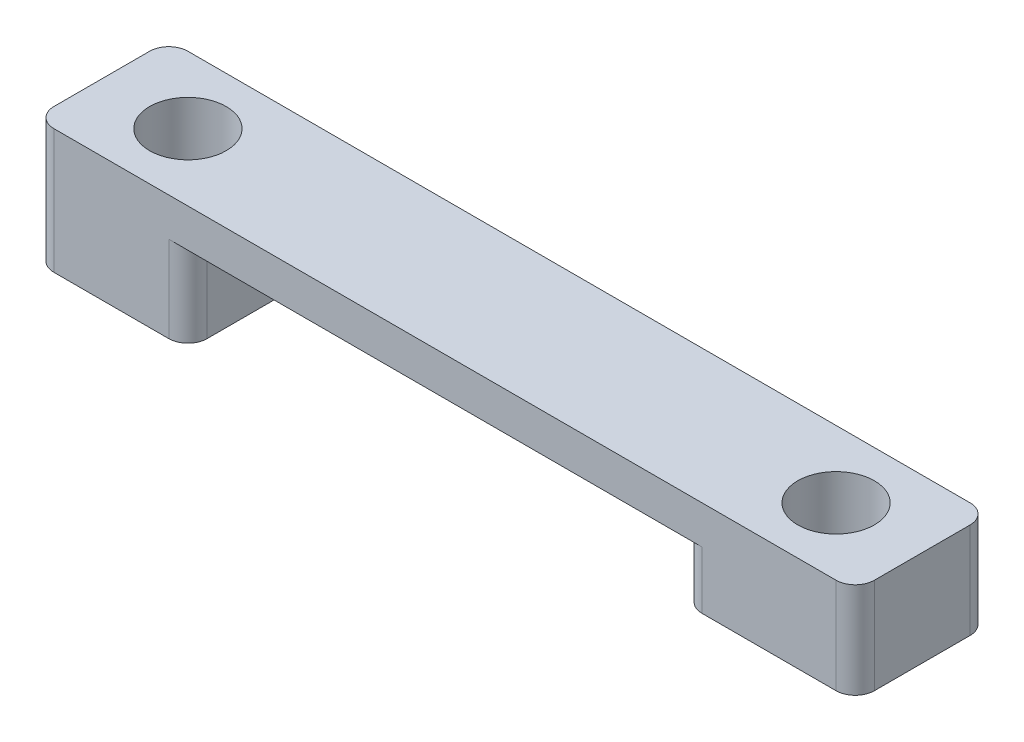
ISO-10303-21;
HEADER;
FILE_DESCRIPTION(('STEP AP214'),'2;1');
FILE_NAME('part.step','',(''),(''),'','','');
FILE_SCHEMA(('AUTOMOTIVE_DESIGN { 1 0 10303 214 1 1 1 1 }'));
ENDSEC;
DATA;
#1=APPLICATION_CONTEXT('core data for automotive mechanical design processes');
#2=APPLICATION_PROTOCOL_DEFINITION('international standard','automotive_design',2000,#1);
#3=PRODUCT_CONTEXT('',#1,'mechanical');
#4=PRODUCT('Part','Part','',(#3));
#5=PRODUCT_RELATED_PRODUCT_CATEGORY('part','',(#4));
#6=PRODUCT_DEFINITION_FORMATION('','',#4);
#7=PRODUCT_DEFINITION_CONTEXT('part definition',#1,'design');
#8=PRODUCT_DEFINITION('design','',#6,#7);
#9=PRODUCT_DEFINITION_SHAPE('','',#8);
#10=(LENGTH_UNIT() NAMED_UNIT(*) SI_UNIT(.MILLI.,.METRE.));
#11=(NAMED_UNIT(*) PLANE_ANGLE_UNIT() SI_UNIT($,.RADIAN.));
#12=(NAMED_UNIT(*) SI_UNIT($,.STERADIAN.) SOLID_ANGLE_UNIT());
#13=UNCERTAINTY_MEASURE_WITH_UNIT(LENGTH_MEASURE(1.E-05),#10,'distance_accuracy_value','');
#14=(GEOMETRIC_REPRESENTATION_CONTEXT(3) GLOBAL_UNCERTAINTY_ASSIGNED_CONTEXT((#13)) GLOBAL_UNIT_ASSIGNED_CONTEXT((#10,
#11,#12)) REPRESENTATION_CONTEXT('',''));
#15=CARTESIAN_POINT('',(0.,0.,0.));
#16=DIRECTION('',(0.,0.,1.));
#17=DIRECTION('',(1.,0.,0.));
#18=AXIS2_PLACEMENT_3D('',#15,#16,#17);
#19=CARTESIAN_POINT('',(20.425,0.,-2.5));
#20=DIRECTION('',(0.,-1.,0.));
#21=DIRECTION('',(0.,0.,-1.));
#22=AXIS2_PLACEMENT_3D('',#19,#20,#21);
#23=PLANE('',#22);
#24=DIRECTION('',(0.,0.,-1.));
#25=VECTOR('',#24,1.);
#26=CARTESIAN_POINT('',(12.425,0.,2.49999999999999));
#27=LINE('',#26,#25);
#28=CARTESIAN_POINT('',(12.425,0.,2.49999999999999));
#29=VERTEX_POINT('',#28);
#30=CARTESIAN_POINT('',(12.425,0.,-2.5));
#31=VERTEX_POINT('',#30);
#32=EDGE_CURVE('E321',#29,#31,#27,.T.);
#33=ORIENTED_EDGE('',*,*,#32,.F.);
#34=CARTESIAN_POINT('',(13.425,0.,2.5));
#35=DIRECTION('',(0.,-1.,0.));
#36=DIRECTION('',(0.,0.,-1.));
#37=AXIS2_PLACEMENT_3D('',#34,#35,#36);
#38=CIRCLE('',#37,1.);
#39=CARTESIAN_POINT('',(13.425,0.,3.5));
#40=VERTEX_POINT('',#39);
#41=EDGE_CURVE('E171',#40,#29,#38,.T.);
#42=ORIENTED_EDGE('',*,*,#41,.F.);
#43=DIRECTION('',(1.,0.,0.));
#44=VECTOR('',#43,1.);
#45=CARTESIAN_POINT('',(-20.425,0.,3.5));
#46=LINE('',#45,#44);
#47=CARTESIAN_POINT('',(-14.425,0.,3.5));
#48=VERTEX_POINT('',#47);
#49=EDGE_CURVE('E230',#48,#40,#46,.T.);
#50=ORIENTED_EDGE('',*,*,#49,.F.);
#51=CARTESIAN_POINT('',(-14.425,0.,2.5));
#52=DIRECTION('',(0.,-1.,0.));
#53=DIRECTION('',(0.,0.,-1.));
#54=AXIS2_PLACEMENT_3D('',#51,#52,#53);
#55=CIRCLE('',#54,1.);
#56=CARTESIAN_POINT('',(-13.425,0.,2.5));
#57=VERTEX_POINT('',#56);
#58=EDGE_CURVE('E186',#57,#48,#55,.T.);
#59=ORIENTED_EDGE('',*,*,#58,.F.);
#60=DIRECTION('',(0.,0.,1.));
#61=VECTOR('',#60,1.);
#62=CARTESIAN_POINT('',(-13.425,0.,2.5));
#63=LINE('',#62,#61);
#64=CARTESIAN_POINT('',(-13.425,0.,-2.5));
#65=VERTEX_POINT('',#64);
#66=EDGE_CURVE('E48',#65,#57,#63,.T.);
#67=ORIENTED_EDGE('',*,*,#66,.F.);
#68=CARTESIAN_POINT('',(-14.425,0.,-2.5));
#69=DIRECTION('',(0.,-1.,0.));
#70=DIRECTION('',(0.,0.,1.));
#71=AXIS2_PLACEMENT_3D('',#68,#69,#70);
#72=CIRCLE('',#71,1.);
#73=CARTESIAN_POINT('',(-14.425,0.,-3.5));
#74=VERTEX_POINT('',#73);
#75=EDGE_CURVE('E176',#74,#65,#72,.T.);
#76=ORIENTED_EDGE('',*,*,#75,.F.);
#77=DIRECTION('',(-1.,0.,0.));
#78=VECTOR('',#77,1.);
#79=CARTESIAN_POINT('',(-20.425,0.,-3.5));
#80=LINE('',#79,#78);
#81=CARTESIAN_POINT('',(13.425,0.,-3.5));
#82=VERTEX_POINT('',#81);
#83=EDGE_CURVE('E56',#82,#74,#80,.T.);
#84=ORIENTED_EDGE('',*,*,#83,.F.);
#85=CARTESIAN_POINT('',(13.425,0.,-2.5));
#86=DIRECTION('',(0.,-1.,0.));
#87=DIRECTION('',(0.,0.,-1.));
#88=AXIS2_PLACEMENT_3D('',#85,#86,#87);
#89=CIRCLE('',#88,1.);
#90=EDGE_CURVE('E167',#31,#82,#89,.T.);
#91=ORIENTED_EDGE('',*,*,#90,.F.);
#92=EDGE_LOOP('',(#33,#42,#50,#59,#67,#76,#84,#91));
#93=FACE_BOUND('',#92,.T.);
#94=ADVANCED_FACE('F33',(#93),#23,.T.);
#95=CARTESIAN_POINT('',(20.425,2.,-2.5));
#96=DIRECTION('',(0.,-1.,0.));
#97=DIRECTION('',(0.,0.,-1.));
#98=AXIS2_PLACEMENT_3D('',#95,#96,#97);
#99=PLANE('',#98);
#100=CARTESIAN_POINT('',(20.425,2.,-2.5));
#101=DIRECTION('',(0.,1.,0.));
#102=DIRECTION('',(0.,0.,-1.));
#103=AXIS2_PLACEMENT_3D('',#100,#101,#102);
#104=CIRCLE('',#103,1.);
#105=CARTESIAN_POINT('',(21.425,2.,-2.49999999999999));
#106=VERTEX_POINT('',#105);
#107=CARTESIAN_POINT('',(20.425,2.,-3.5));
#108=VERTEX_POINT('',#107);
#109=EDGE_CURVE('E226',#106,#108,#104,.T.);
#110=ORIENTED_EDGE('',*,*,#109,.T.);
#111=DIRECTION('',(-1.,0.,0.));
#112=VECTOR('',#111,1.);
#113=CARTESIAN_POINT('',(-20.425,2.,-3.5));
#114=LINE('',#113,#112);
#115=CARTESIAN_POINT('',(-20.425,2.,-3.5));
#116=VERTEX_POINT('',#115);
#117=EDGE_CURVE('E229',#108,#116,#114,.T.);
#118=ORIENTED_EDGE('',*,*,#117,.T.);
#119=CARTESIAN_POINT('',(-20.425,2.,-2.5));
#120=DIRECTION('',(0.,1.,0.));
#121=DIRECTION('',(0.,0.,-1.));
#122=AXIS2_PLACEMENT_3D('',#119,#120,#121);
#123=CIRCLE('',#122,1.);
#124=CARTESIAN_POINT('',(-21.425,2.,-2.49999999999999));
#125=VERTEX_POINT('',#124);
#126=EDGE_CURVE('E232',#116,#125,#123,.T.);
#127=ORIENTED_EDGE('',*,*,#126,.T.);
#128=DIRECTION('',(0.,0.,1.));
#129=VECTOR('',#128,1.);
#130=CARTESIAN_POINT('',(-21.425,2.,2.49999999999999));
#131=LINE('',#130,#129);
#132=CARTESIAN_POINT('',(-21.425,2.,2.49999999999999));
#133=VERTEX_POINT('',#132);
#134=EDGE_CURVE('E234',#125,#133,#131,.T.);
#135=ORIENTED_EDGE('',*,*,#134,.T.);
#136=CARTESIAN_POINT('',(-20.425,2.,2.5));
#137=DIRECTION('',(0.,1.,0.));
#138=DIRECTION('',(0.,0.,-1.));
#139=AXIS2_PLACEMENT_3D('',#136,#137,#138);
#140=CIRCLE('',#139,1.);
#141=CARTESIAN_POINT('',(-20.425,2.,3.5));
#142=VERTEX_POINT('',#141);
#143=EDGE_CURVE('E236',#133,#142,#140,.T.);
#144=ORIENTED_EDGE('',*,*,#143,.T.);
#145=DIRECTION('',(1.,0.,0.));
#146=VECTOR('',#145,1.);
#147=CARTESIAN_POINT('',(-20.425,2.,3.5));
#148=LINE('',#147,#146);
#149=CARTESIAN_POINT('',(20.425,2.,3.5));
#150=VERTEX_POINT('',#149);
#151=EDGE_CURVE('E238',#142,#150,#148,.T.);
#152=ORIENTED_EDGE('',*,*,#151,.T.);
#153=CARTESIAN_POINT('',(20.425,2.,2.5));
#154=DIRECTION('',(0.,1.,0.));
#155=DIRECTION('',(0.,0.,1.));
#156=AXIS2_PLACEMENT_3D('',#153,#154,#155);
#157=CIRCLE('',#156,1.);
#158=CARTESIAN_POINT('',(21.425,2.,2.49999999999999));
#159=VERTEX_POINT('',#158);
#160=EDGE_CURVE('E240',#150,#159,#157,.T.);
#161=ORIENTED_EDGE('',*,*,#160,.T.);
#162=DIRECTION('',(0.,0.,-1.));
#163=VECTOR('',#162,1.);
#164=CARTESIAN_POINT('',(21.425,2.,2.49999999999999));
#165=LINE('',#164,#163);
#166=EDGE_CURVE('E242',#159,#106,#165,.T.);
#167=ORIENTED_EDGE('',*,*,#166,.T.);
#168=EDGE_LOOP('',(#110,#118,#127,#135,#144,#152,#161,#167));
#169=FACE_BOUND('',#168,.T.);
#170=CARTESIAN_POINT('',(-16.925,2.,0.));
#171=DIRECTION('',(0.,1.,0.));
#172=DIRECTION('',(0.,0.,1.));
#173=AXIS2_PLACEMENT_3D('',#170,#171,#172);
#174=CIRCLE('',#173,2.);
#175=CARTESIAN_POINT('',(-16.925,2.,2.));
#176=VERTEX_POINT('',#175);
#177=EDGE_CURVE('E223',#176,#176,#174,.T.);
#178=ORIENTED_EDGE('',*,*,#177,.F.);
#179=EDGE_LOOP('',(#178));
#180=FACE_BOUND('',#179,.T.);
#181=CARTESIAN_POINT('',(16.925,2.,0.));
#182=DIRECTION('',(0.,1.,0.));
#183=DIRECTION('',(0.,0.,1.));
#184=AXIS2_PLACEMENT_3D('',#181,#182,#183);
#185=CIRCLE('',#184,2.);
#186=CARTESIAN_POINT('',(16.925,2.,2.));
#187=VERTEX_POINT('',#186);
#188=EDGE_CURVE('E220',#187,#187,#185,.T.);
#189=ORIENTED_EDGE('',*,*,#188,.F.);
#190=EDGE_LOOP('',(#189));
#191=FACE_BOUND('',#190,.T.);
#192=ADVANCED_FACE('F295',(#169,#180,#191),#99,.F.);
#193=CARTESIAN_POINT('',(20.425,2.,-2.5));
#194=DIRECTION('',(0.,-1.,0.));
#195=DIRECTION('',(0.,0.,-1.));
#196=AXIS2_PLACEMENT_3D('',#193,#194,#195);
#197=CYLINDRICAL_SURFACE('',#196,1.);
#198=DIRECTION('',(0.,-1.,0.));
#199=VECTOR('',#198,1.);
#200=CARTESIAN_POINT('',(21.425,2.,-2.49999999999999));
#201=LINE('',#200,#199);
#202=CARTESIAN_POINT('',(21.425,-3.,-2.5));
#203=VERTEX_POINT('',#202);
#204=EDGE_CURVE('E244',#106,#203,#201,.T.);
#205=ORIENTED_EDGE('',*,*,#204,.T.);
#206=CARTESIAN_POINT('',(20.425,-3.,-2.5));
#207=DIRECTION('',(0.,-1.,0.));
#208=DIRECTION('',(0.,0.,1.));
#209=AXIS2_PLACEMENT_3D('',#206,#207,#208);
#210=CIRCLE('',#209,1.);
#211=CARTESIAN_POINT('',(20.425,-3.,-3.5));
#212=VERTEX_POINT('',#211);
#213=EDGE_CURVE('E306',#212,#203,#210,.T.);
#214=ORIENTED_EDGE('',*,*,#213,.F.);
#215=DIRECTION('',(0.,-1.,0.));
#216=VECTOR('',#215,1.);
#217=CARTESIAN_POINT('',(20.425,2.,-3.5));
#218=LINE('',#217,#216);
#219=EDGE_CURVE('E11',#108,#212,#218,.T.);
#220=ORIENTED_EDGE('',*,*,#219,.F.);
#221=ORIENTED_EDGE('',*,*,#109,.F.);
#222=EDGE_LOOP('',(#205,#214,#220,#221));
#223=FACE_BOUND('',#222,.T.);
#224=ADVANCED_FACE('F35',(#223),#197,.T.);
#225=CARTESIAN_POINT('',(-20.425,2.,-3.5));
#226=DIRECTION('',(0.,0.,1.));
#227=DIRECTION('',(1.,0.,0.));
#228=AXIS2_PLACEMENT_3D('',#225,#226,#227);
#229=PLANE('',#228);
#230=ORIENTED_EDGE('',*,*,#219,.T.);
#231=DIRECTION('',(1.,0.,0.));
#232=VECTOR('',#231,1.);
#233=CARTESIAN_POINT('',(20.425,-3.,-3.5));
#234=LINE('',#233,#232);
#235=CARTESIAN_POINT('',(13.425,-3.,-3.5));
#236=VERTEX_POINT('',#235);
#237=EDGE_CURVE('E301',#236,#212,#234,.T.);
#238=ORIENTED_EDGE('',*,*,#237,.F.);
#239=DIRECTION('',(0.,1.,0.));
#240=VECTOR('',#239,1.);
#241=CARTESIAN_POINT('',(13.425,-3.,-3.5));
#242=LINE('',#241,#240);
#243=EDGE_CURVE('E178',#236,#82,#242,.T.);
#244=ORIENTED_EDGE('',*,*,#243,.T.);
#245=ORIENTED_EDGE('',*,*,#83,.T.);
#246=DIRECTION('',(0.,1.,0.));
#247=VECTOR('',#246,1.);
#248=CARTESIAN_POINT('',(-14.425,-4.5,-3.5));
#249=LINE('',#248,#247);
#250=CARTESIAN_POINT('',(-14.425,-4.5,-3.5));
#251=VERTEX_POINT('',#250);
#252=EDGE_CURVE('E204',#251,#74,#249,.T.);
#253=ORIENTED_EDGE('',*,*,#252,.F.);
#254=DIRECTION('',(1.,0.,0.));
#255=VECTOR('',#254,1.);
#256=CARTESIAN_POINT('',(-14.425,-4.5,-3.5));
#257=LINE('',#256,#255);
#258=CARTESIAN_POINT('',(-20.425,-4.5,-3.5));
#259=VERTEX_POINT('',#258);
#260=EDGE_CURVE('E202',#259,#251,#257,.T.);
#261=ORIENTED_EDGE('',*,*,#260,.F.);
#262=DIRECTION('',(0.,-1.,0.));
#263=VECTOR('',#262,1.);
#264=CARTESIAN_POINT('',(-20.425,2.,-3.5));
#265=LINE('',#264,#263);
#266=EDGE_CURVE('E41',#116,#259,#265,.T.);
#267=ORIENTED_EDGE('',*,*,#266,.F.);
#268=ORIENTED_EDGE('',*,*,#117,.F.);
#269=EDGE_LOOP('',(#230,#238,#244,#245,#253,#261,#267,#268));
#270=FACE_BOUND('',#269,.T.);
#271=ADVANCED_FACE('F269',(#270),#229,.F.);
#272=CARTESIAN_POINT('',(-20.425,2.,-2.5));
#273=DIRECTION('',(0.,-1.,0.));
#274=DIRECTION('',(0.,0.,-1.));
#275=AXIS2_PLACEMENT_3D('',#272,#273,#274);
#276=CYLINDRICAL_SURFACE('',#275,1.);
#277=ORIENTED_EDGE('',*,*,#266,.T.);
#278=CARTESIAN_POINT('',(-20.425,-4.5,-2.5));
#279=DIRECTION('',(0.,-1.,0.));
#280=DIRECTION('',(0.,0.,1.));
#281=AXIS2_PLACEMENT_3D('',#278,#279,#280);
#282=CIRCLE('',#281,1.);
#283=CARTESIAN_POINT('',(-21.425,-4.5,-2.5));
#284=VERTEX_POINT('',#283);
#285=EDGE_CURVE('E199',#284,#259,#282,.T.);
#286=ORIENTED_EDGE('',*,*,#285,.F.);
#287=DIRECTION('',(0.,-1.,0.));
#288=VECTOR('',#287,1.);
#289=CARTESIAN_POINT('',(-21.425,2.,-2.49999999999999));
#290=LINE('',#289,#288);
#291=EDGE_CURVE('E257',#125,#284,#290,.T.);
#292=ORIENTED_EDGE('',*,*,#291,.F.);
#293=ORIENTED_EDGE('',*,*,#126,.F.);
#294=EDGE_LOOP('',(#277,#286,#292,#293));
#295=FACE_BOUND('',#294,.T.);
#296=ADVANCED_FACE('F262',(#295),#276,.T.);
#297=CARTESIAN_POINT('',(-21.425,2.,2.49999999999999));
#298=DIRECTION('',(1.,0.,0.));
#299=DIRECTION('',(0.,0.,-1.));
#300=AXIS2_PLACEMENT_3D('',#297,#298,#299);
#301=PLANE('',#300);
#302=ORIENTED_EDGE('',*,*,#291,.T.);
#303=DIRECTION('',(0.,0.,-1.));
#304=VECTOR('',#303,1.);
#305=CARTESIAN_POINT('',(-21.425,-4.5,-2.5));
#306=LINE('',#305,#304);
#307=CARTESIAN_POINT('',(-21.425,-4.5,2.5));
#308=VERTEX_POINT('',#307);
#309=EDGE_CURVE('E196',#308,#284,#306,.T.);
#310=ORIENTED_EDGE('',*,*,#309,.F.);
#311=DIRECTION('',(0.,-1.,0.));
#312=VECTOR('',#311,1.);
#313=CARTESIAN_POINT('',(-21.425,2.,2.49999999999999));
#314=LINE('',#313,#312);
#315=EDGE_CURVE('E255',#133,#308,#314,.T.);
#316=ORIENTED_EDGE('',*,*,#315,.F.);
#317=ORIENTED_EDGE('',*,*,#134,.F.);
#318=EDGE_LOOP('',(#302,#310,#316,#317));
#319=FACE_BOUND('',#318,.T.);
#320=ADVANCED_FACE('F293',(#319),#301,.F.);
#321=CARTESIAN_POINT('',(-20.425,2.,2.5));
#322=DIRECTION('',(0.,-1.,0.));
#323=DIRECTION('',(0.,0.,-1.));
#324=AXIS2_PLACEMENT_3D('',#321,#322,#323);
#325=CYLINDRICAL_SURFACE('',#324,1.);
#326=ORIENTED_EDGE('',*,*,#315,.T.);
#327=CARTESIAN_POINT('',(-20.425,-4.5,2.5));
#328=DIRECTION('',(0.,-1.,0.));
#329=DIRECTION('',(0.,0.,-1.));
#330=AXIS2_PLACEMENT_3D('',#327,#328,#329);
#331=CIRCLE('',#330,1.);
#332=CARTESIAN_POINT('',(-20.425,-4.5,3.5));
#333=VERTEX_POINT('',#332);
#334=EDGE_CURVE('E193',#333,#308,#331,.T.);
#335=ORIENTED_EDGE('',*,*,#334,.F.);
#336=DIRECTION('',(0.,-1.,0.));
#337=VECTOR('',#336,1.);
#338=CARTESIAN_POINT('',(-20.425,2.,3.5));
#339=LINE('',#338,#337);
#340=EDGE_CURVE('E253',#142,#333,#339,.T.);
#341=ORIENTED_EDGE('',*,*,#340,.F.);
#342=ORIENTED_EDGE('',*,*,#143,.F.);
#343=EDGE_LOOP('',(#326,#335,#341,#342));
#344=FACE_BOUND('',#343,.T.);
#345=ADVANCED_FACE('F288',(#344),#325,.T.);
#346=CARTESIAN_POINT('',(-20.425,2.,3.5));
#347=DIRECTION('',(0.,0.,-1.));
#348=DIRECTION('',(-1.,0.,0.));
#349=AXIS2_PLACEMENT_3D('',#346,#347,#348);
#350=PLANE('',#349);
#351=ORIENTED_EDGE('',*,*,#340,.T.);
#352=DIRECTION('',(-1.,0.,0.));
#353=VECTOR('',#352,1.);
#354=CARTESIAN_POINT('',(-14.425,-4.5,3.5));
#355=LINE('',#354,#353);
#356=CARTESIAN_POINT('',(-14.425,-4.5,3.5));
#357=VERTEX_POINT('',#356);
#358=EDGE_CURVE('E190',#357,#333,#355,.T.);
#359=ORIENTED_EDGE('',*,*,#358,.F.);
#360=DIRECTION('',(0.,1.,0.));
#361=VECTOR('',#360,1.);
#362=CARTESIAN_POINT('',(-14.425,-4.5,3.5));
#363=LINE('',#362,#361);
#364=EDGE_CURVE('E212',#357,#48,#363,.T.);
#365=ORIENTED_EDGE('',*,*,#364,.T.);
#366=ORIENTED_EDGE('',*,*,#49,.T.);
#367=DIRECTION('',(0.,1.,0.));
#368=VECTOR('',#367,1.);
#369=CARTESIAN_POINT('',(13.425,-3.,3.5));
#370=LINE('',#369,#368);
#371=CARTESIAN_POINT('',(13.425,-3.,3.5));
#372=VERTEX_POINT('',#371);
#373=EDGE_CURVE('E319',#372,#40,#370,.T.);
#374=ORIENTED_EDGE('',*,*,#373,.F.);
#375=DIRECTION('',(-1.,0.,0.));
#376=VECTOR('',#375,1.);
#377=CARTESIAN_POINT('',(13.425,-3.,3.5));
#378=LINE('',#377,#376);
#379=CARTESIAN_POINT('',(20.425,-3.,3.5));
#380=VERTEX_POINT('',#379);
#381=EDGE_CURVE('E164',#380,#372,#378,.T.);
#382=ORIENTED_EDGE('',*,*,#381,.F.);
#383=DIRECTION('',(0.,-1.,0.));
#384=VECTOR('',#383,1.);
#385=CARTESIAN_POINT('',(20.425,2.,3.5));
#386=LINE('',#385,#384);
#387=EDGE_CURVE('E251',#150,#380,#386,.T.);
#388=ORIENTED_EDGE('',*,*,#387,.F.);
#389=ORIENTED_EDGE('',*,*,#151,.F.);
#390=EDGE_LOOP('',(#351,#359,#365,#366,#374,#382,#388,#389));
#391=FACE_BOUND('',#390,.T.);
#392=ADVANCED_FACE('F283',(#391),#350,.F.);
#393=CARTESIAN_POINT('',(20.425,2.,2.5));
#394=DIRECTION('',(0.,-1.,0.));
#395=DIRECTION('',(0.,0.,-1.));
#396=AXIS2_PLACEMENT_3D('',#393,#394,#395);
#397=CYLINDRICAL_SURFACE('',#396,1.);
#398=ORIENTED_EDGE('',*,*,#387,.T.);
#399=CARTESIAN_POINT('',(20.425,-3.,2.5));
#400=DIRECTION('',(0.,-1.,0.));
#401=DIRECTION('',(0.,0.,1.));
#402=AXIS2_PLACEMENT_3D('',#399,#400,#401);
#403=CIRCLE('',#402,1.);
#404=CARTESIAN_POINT('',(21.425,-3.,2.49999999999999));
#405=VERTEX_POINT('',#404);
#406=EDGE_CURVE('E313',#405,#380,#403,.T.);
#407=ORIENTED_EDGE('',*,*,#406,.F.);
#408=DIRECTION('',(0.,-1.,0.));
#409=VECTOR('',#408,1.);
#410=CARTESIAN_POINT('',(21.425,2.,2.49999999999999));
#411=LINE('',#410,#409);
#412=EDGE_CURVE('E249',#159,#405,#411,.T.);
#413=ORIENTED_EDGE('',*,*,#412,.F.);
#414=ORIENTED_EDGE('',*,*,#160,.F.);
#415=EDGE_LOOP('',(#398,#407,#413,#414));
#416=FACE_BOUND('',#415,.T.);
#417=ADVANCED_FACE('F354',(#416),#397,.T.);
#418=CARTESIAN_POINT('',(21.425,2.,2.49999999999999));
#419=DIRECTION('',(-1.,0.,0.));
#420=DIRECTION('',(0.,0.,1.));
#421=AXIS2_PLACEMENT_3D('',#418,#419,#420);
#422=PLANE('',#421);
#423=ORIENTED_EDGE('',*,*,#412,.T.);
#424=DIRECTION('',(0.,0.,1.));
#425=VECTOR('',#424,1.);
#426=CARTESIAN_POINT('',(21.425,-3.,2.49999999999999));
#427=LINE('',#426,#425);
#428=EDGE_CURVE('E311',#203,#405,#427,.T.);
#429=ORIENTED_EDGE('',*,*,#428,.F.);
#430=ORIENTED_EDGE('',*,*,#204,.F.);
#431=ORIENTED_EDGE('',*,*,#166,.F.);
#432=EDGE_LOOP('',(#423,#429,#430,#431));
#433=FACE_BOUND('',#432,.T.);
#434=ADVANCED_FACE('F350',(#433),#422,.F.);
#435=CARTESIAN_POINT('',(-16.925,2.,0.));
#436=DIRECTION('',(0.,-1.,0.));
#437=DIRECTION('',(0.,0.,-1.));
#438=AXIS2_PLACEMENT_3D('',#435,#436,#437);
#439=CYLINDRICAL_SURFACE('',#438,2.);
#440=ORIENTED_EDGE('',*,*,#177,.T.);
#441=EDGE_LOOP('',(#440));
#442=FACE_BOUND('',#441,.T.);
#443=CARTESIAN_POINT('',(-16.925,-4.5,0.));
#444=DIRECTION('',(0.,-1.,0.));
#445=DIRECTION('',(0.,0.,-1.));
#446=AXIS2_PLACEMENT_3D('',#443,#444,#445);
#447=CIRCLE('',#446,2.);
#448=CARTESIAN_POINT('',(-16.925,-4.5,-2.));
#449=VERTEX_POINT('',#448);
#450=EDGE_CURVE('E173',#449,#449,#447,.T.);
#451=ORIENTED_EDGE('',*,*,#450,.T.);
#452=EDGE_LOOP('',(#451));
#453=FACE_BOUND('',#452,.T.);
#454=ADVANCED_FACE('F353',(#442,#453),#439,.F.);
#455=CARTESIAN_POINT('',(16.925,2.,0.));
#456=DIRECTION('',(0.,-1.,0.));
#457=DIRECTION('',(0.,0.,-1.));
#458=AXIS2_PLACEMENT_3D('',#455,#456,#457);
#459=CYLINDRICAL_SURFACE('',#458,2.);
#460=ORIENTED_EDGE('',*,*,#188,.T.);
#461=EDGE_LOOP('',(#460));
#462=FACE_BOUND('',#461,.T.);
#463=CARTESIAN_POINT('',(16.925,-3.,0.));
#464=DIRECTION('',(0.,-1.,0.));
#465=DIRECTION('',(0.,0.,-1.));
#466=AXIS2_PLACEMENT_3D('',#463,#464,#465);
#467=CIRCLE('',#466,2.);
#468=CARTESIAN_POINT('',(16.925,-3.,-2.00000000000001));
#469=VERTEX_POINT('',#468);
#470=EDGE_CURVE('E322',#469,#469,#467,.T.);
#471=ORIENTED_EDGE('',*,*,#470,.T.);
#472=EDGE_LOOP('',(#471));
#473=FACE_BOUND('',#472,.T.);
#474=ADVANCED_FACE('F332',(#462,#473),#459,.F.);
#475=CARTESIAN_POINT('',(-14.425,-4.5,-2.5));
#476=DIRECTION('',(0.,1.,0.));
#477=DIRECTION('',(0.,0.,1.));
#478=AXIS2_PLACEMENT_3D('',#475,#476,#477);
#479=PLANE('',#478);
#480=CARTESIAN_POINT('',(-14.425,-4.5,-2.5));
#481=DIRECTION('',(0.,-1.,0.));
#482=DIRECTION('',(0.,0.,1.));
#483=AXIS2_PLACEMENT_3D('',#480,#481,#482);
#484=CIRCLE('',#483,1.);
#485=CARTESIAN_POINT('',(-13.425,-4.5,-2.5));
#486=VERTEX_POINT('',#485);
#487=EDGE_CURVE('E182',#251,#486,#484,.T.);
#488=ORIENTED_EDGE('',*,*,#487,.T.);
#489=DIRECTION('',(0.,0.,1.));
#490=VECTOR('',#489,1.);
#491=CARTESIAN_POINT('',(-13.425,-4.5,2.5));
#492=LINE('',#491,#490);
#493=CARTESIAN_POINT('',(-13.425,-4.5,2.5));
#494=VERTEX_POINT('',#493);
#495=EDGE_CURVE('E185',#486,#494,#492,.T.);
#496=ORIENTED_EDGE('',*,*,#495,.T.);
#497=CARTESIAN_POINT('',(-14.425,-4.5,2.5));
#498=DIRECTION('',(0.,-1.,0.));
#499=DIRECTION('',(0.,0.,-1.));
#500=AXIS2_PLACEMENT_3D('',#497,#498,#499);
#501=CIRCLE('',#500,1.);
#502=EDGE_CURVE('E188',#494,#357,#501,.T.);
#503=ORIENTED_EDGE('',*,*,#502,.T.);
#504=ORIENTED_EDGE('',*,*,#358,.T.);
#505=ORIENTED_EDGE('',*,*,#334,.T.);
#506=ORIENTED_EDGE('',*,*,#309,.T.);
#507=ORIENTED_EDGE('',*,*,#285,.T.);
#508=ORIENTED_EDGE('',*,*,#260,.T.);
#509=EDGE_LOOP('',(#488,#496,#503,#504,#505,#506,#507,#508));
#510=FACE_BOUND('',#509,.T.);
#511=ORIENTED_EDGE('',*,*,#450,.F.);
#512=EDGE_LOOP('',(#511));
#513=FACE_BOUND('',#512,.T.);
#514=ADVANCED_FACE('F266',(#510,#513),#479,.F.);
#515=CARTESIAN_POINT('',(-14.425,-4.5,-2.5));
#516=DIRECTION('',(0.,1.,0.));
#517=DIRECTION('',(0.,0.,1.));
#518=AXIS2_PLACEMENT_3D('',#515,#516,#517);
#519=CYLINDRICAL_SURFACE('',#518,1.);
#520=ORIENTED_EDGE('',*,*,#75,.T.);
#521=DIRECTION('',(0.,1.,0.));
#522=VECTOR('',#521,1.);
#523=CARTESIAN_POINT('',(-13.425,-4.5,-2.5));
#524=LINE('',#523,#522);
#525=EDGE_CURVE('E218',#486,#65,#524,.T.);
#526=ORIENTED_EDGE('',*,*,#525,.F.);
#527=ORIENTED_EDGE('',*,*,#487,.F.);
#528=ORIENTED_EDGE('',*,*,#252,.T.);
#529=EDGE_LOOP('',(#520,#526,#527,#528));
#530=FACE_BOUND('',#529,.T.);
#531=ADVANCED_FACE('F273',(#530),#519,.T.);
#532=CARTESIAN_POINT('',(-13.425,-4.5,2.5));
#533=DIRECTION('',(-1.,0.,0.));
#534=DIRECTION('',(0.,0.,1.));
#535=AXIS2_PLACEMENT_3D('',#532,#533,#534);
#536=PLANE('',#535);
#537=ORIENTED_EDGE('',*,*,#66,.T.);
#538=DIRECTION('',(0.,1.,0.));
#539=VECTOR('',#538,1.);
#540=CARTESIAN_POINT('',(-13.425,-4.5,2.5));
#541=LINE('',#540,#539);
#542=EDGE_CURVE('E215',#494,#57,#541,.T.);
#543=ORIENTED_EDGE('',*,*,#542,.F.);
#544=ORIENTED_EDGE('',*,*,#495,.F.);
#545=ORIENTED_EDGE('',*,*,#525,.T.);
#546=EDGE_LOOP('',(#537,#543,#544,#545));
#547=FACE_BOUND('',#546,.T.);
#548=ADVANCED_FACE('F278',(#547),#536,.F.);
#549=CARTESIAN_POINT('',(-14.425,-4.5,2.5));
#550=DIRECTION('',(0.,1.,0.));
#551=DIRECTION('',(0.,0.,1.));
#552=AXIS2_PLACEMENT_3D('',#549,#550,#551);
#553=CYLINDRICAL_SURFACE('',#552,1.);
#554=ORIENTED_EDGE('',*,*,#58,.T.);
#555=ORIENTED_EDGE('',*,*,#364,.F.);
#556=ORIENTED_EDGE('',*,*,#502,.F.);
#557=ORIENTED_EDGE('',*,*,#542,.T.);
#558=EDGE_LOOP('',(#554,#555,#556,#557));
#559=FACE_BOUND('',#558,.T.);
#560=ADVANCED_FACE('F280',(#559),#553,.T.);
#561=CARTESIAN_POINT('',(13.425,-3.,2.5));
#562=DIRECTION('',(0.,-1.,0.));
#563=DIRECTION('',(0.,0.,-1.));
#564=AXIS2_PLACEMENT_3D('',#561,#562,#563);
#565=PLANE('',#564);
#566=CARTESIAN_POINT('',(13.425,-3.,2.5));
#567=DIRECTION('',(0.,-1.,0.));
#568=DIRECTION('',(0.,0.,-1.));
#569=AXIS2_PLACEMENT_3D('',#566,#567,#568);
#570=CIRCLE('',#569,1.);
#571=CARTESIAN_POINT('',(12.425,-3.,2.49999999999999));
#572=VERTEX_POINT('',#571);
#573=EDGE_CURVE('E157',#372,#572,#570,.T.);
#574=ORIENTED_EDGE('',*,*,#573,.T.);
#575=DIRECTION('',(0.,0.,-1.));
#576=VECTOR('',#575,1.);
#577=CARTESIAN_POINT('',(12.425,-3.,2.49999999999999));
#578=LINE('',#577,#576);
#579=CARTESIAN_POINT('',(12.425,-3.,-2.5));
#580=VERTEX_POINT('',#579);
#581=EDGE_CURVE('E146',#572,#580,#578,.T.);
#582=ORIENTED_EDGE('',*,*,#581,.T.);
#583=CARTESIAN_POINT('',(13.425,-3.,-2.5));
#584=DIRECTION('',(0.,-1.,0.));
#585=DIRECTION('',(0.,0.,-1.));
#586=AXIS2_PLACEMENT_3D('',#583,#584,#585);
#587=CIRCLE('',#586,1.);
#588=EDGE_CURVE('E156',#580,#236,#587,.T.);
#589=ORIENTED_EDGE('',*,*,#588,.T.);
#590=ORIENTED_EDGE('',*,*,#237,.T.);
#591=ORIENTED_EDGE('',*,*,#213,.T.);
#592=ORIENTED_EDGE('',*,*,#428,.T.);
#593=ORIENTED_EDGE('',*,*,#406,.T.);
#594=ORIENTED_EDGE('',*,*,#381,.T.);
#595=EDGE_LOOP('',(#574,#582,#589,#590,#591,#592,#593,#594));
#596=FACE_BOUND('',#595,.T.);
#597=ORIENTED_EDGE('',*,*,#470,.F.);
#598=EDGE_LOOP('',(#597));
#599=FACE_BOUND('',#598,.T.);
#600=ADVANCED_FACE('F160',(#596,#599),#565,.T.);
#601=CARTESIAN_POINT('',(13.425,-3.,2.5));
#602=DIRECTION('',(0.,1.,0.));
#603=DIRECTION('',(0.,0.,1.));
#604=AXIS2_PLACEMENT_3D('',#601,#602,#603);
#605=CYLINDRICAL_SURFACE('',#604,1.);
#606=ORIENTED_EDGE('',*,*,#41,.T.);
#607=DIRECTION('',(0.,1.,0.));
#608=VECTOR('',#607,1.);
#609=CARTESIAN_POINT('',(12.425,-3.,2.49999999999999));
#610=LINE('',#609,#608);
#611=EDGE_CURVE('E150',#572,#29,#610,.T.);
#612=ORIENTED_EDGE('',*,*,#611,.F.);
#613=ORIENTED_EDGE('',*,*,#573,.F.);
#614=ORIENTED_EDGE('',*,*,#373,.T.);
#615=EDGE_LOOP('',(#606,#612,#613,#614));
#616=FACE_BOUND('',#615,.T.);
#617=ADVANCED_FACE('F169',(#616),#605,.T.);
#618=CARTESIAN_POINT('',(12.425,-3.,2.49999999999999));
#619=DIRECTION('',(1.,0.,0.));
#620=DIRECTION('',(0.,0.,-1.));
#621=AXIS2_PLACEMENT_3D('',#618,#619,#620);
#622=PLANE('',#621);
#623=ORIENTED_EDGE('',*,*,#32,.T.);
#624=DIRECTION('',(0.,1.,0.));
#625=VECTOR('',#624,1.);
#626=CARTESIAN_POINT('',(12.425,-3.,-2.5));
#627=LINE('',#626,#625);
#628=EDGE_CURVE('E153',#580,#31,#627,.T.);
#629=ORIENTED_EDGE('',*,*,#628,.F.);
#630=ORIENTED_EDGE('',*,*,#581,.F.);
#631=ORIENTED_EDGE('',*,*,#611,.T.);
#632=EDGE_LOOP('',(#623,#629,#630,#631));
#633=FACE_BOUND('',#632,.T.);
#634=ADVANCED_FACE('F148',(#633),#622,.F.);
#635=CARTESIAN_POINT('',(13.425,-3.,-2.5));
#636=DIRECTION('',(0.,1.,0.));
#637=DIRECTION('',(0.,0.,1.));
#638=AXIS2_PLACEMENT_3D('',#635,#636,#637);
#639=CYLINDRICAL_SURFACE('',#638,1.);
#640=ORIENTED_EDGE('',*,*,#90,.T.);
#641=ORIENTED_EDGE('',*,*,#243,.F.);
#642=ORIENTED_EDGE('',*,*,#588,.F.);
#643=ORIENTED_EDGE('',*,*,#628,.T.);
#644=EDGE_LOOP('',(#640,#641,#642,#643));
#645=FACE_BOUND('',#644,.T.);
#646=ADVANCED_FACE('F327',(#645),#639,.T.);
#647=CLOSED_SHELL('',(#94,#192,#224,#271,#296,#320,#345,#392,#417,#434,#454,#474,#514,#531,#548,
#560,#600,#617,#634,#646));
#648=MANIFOLD_SOLID_BREP('B2',#647);
#649=ADVANCED_BREP_SHAPE_REPRESENTATION('',(#18,#648),#14);
#650=SHAPE_DEFINITION_REPRESENTATION(#9,#649);
ENDSEC;
END-ISO-10303-21;
